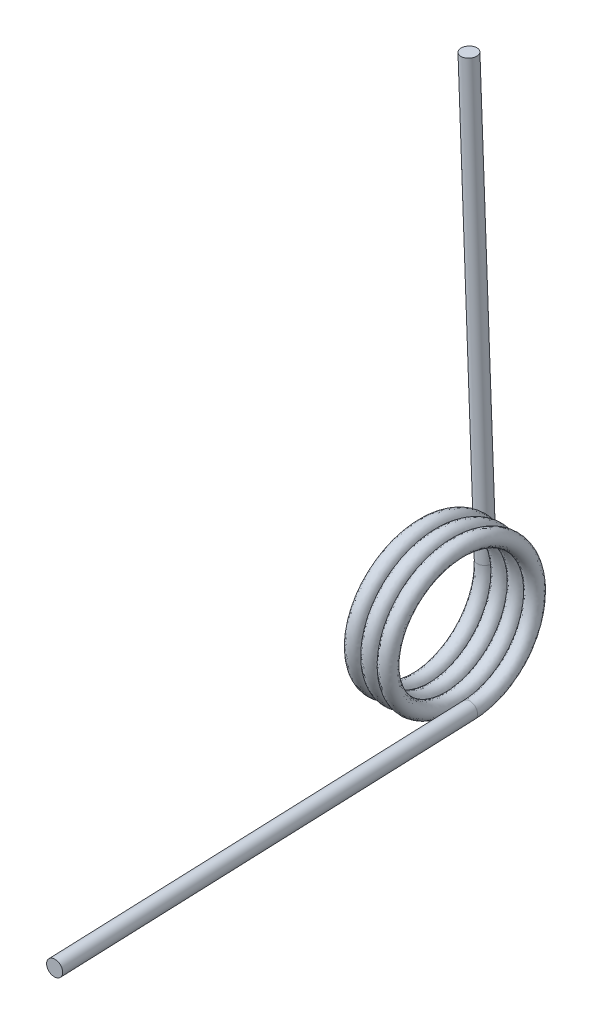
ISO-10303-21;
HEADER;
FILE_DESCRIPTION(('STEP AP214'),'2;1');
FILE_NAME('part.step','',(''),(''),'','','');
FILE_SCHEMA(('AUTOMOTIVE_DESIGN { 1 0 10303 214 1 1 1 1 }'));
ENDSEC;
DATA;
#1=APPLICATION_CONTEXT('core data for automotive mechanical design processes');
#2=APPLICATION_PROTOCOL_DEFINITION('international standard','automotive_design',2000,#1);
#3=PRODUCT_CONTEXT('',#1,'mechanical');
#4=PRODUCT('Part','Part','',(#3));
#5=PRODUCT_RELATED_PRODUCT_CATEGORY('part','',(#4));
#6=PRODUCT_DEFINITION_FORMATION('','',#4);
#7=PRODUCT_DEFINITION_CONTEXT('part definition',#1,'design');
#8=PRODUCT_DEFINITION('design','',#6,#7);
#9=PRODUCT_DEFINITION_SHAPE('','',#8);
#10=(LENGTH_UNIT() NAMED_UNIT(*) SI_UNIT(.MILLI.,.METRE.));
#11=(NAMED_UNIT(*) PLANE_ANGLE_UNIT() SI_UNIT($,.RADIAN.));
#12=(NAMED_UNIT(*) SI_UNIT($,.STERADIAN.) SOLID_ANGLE_UNIT());
#13=UNCERTAINTY_MEASURE_WITH_UNIT(LENGTH_MEASURE(1.E-05),#10,'distance_accuracy_value','');
#14=(GEOMETRIC_REPRESENTATION_CONTEXT(3) GLOBAL_UNCERTAINTY_ASSIGNED_CONTEXT((#13)) GLOBAL_UNIT_ASSIGNED_CONTEXT((#10,
#11,#12)) REPRESENTATION_CONTEXT('',''));
#15=CARTESIAN_POINT('',(0.,0.,0.));
#16=DIRECTION('',(0.,0.,1.));
#17=DIRECTION('',(1.,0.,0.));
#18=AXIS2_PLACEMENT_3D('',#15,#16,#17);
#19=CARTESIAN_POINT('',(0.228436864439154,0.00863475333797731,-2.032));
#20=CARTESIAN_POINT('',(0.26865353110582,-1.16454099365534,-2.03698527716407));
#21=CARTESIAN_POINT('',(0.308870197772487,-1.75544624382099,-1.0234779157461));
#22=CARTESIAN_POINT('',(0.349086864439153,-2.34635149398664,-0.00997055432813458));
#23=CARTESIAN_POINT('',(0.38930353110582,-1.76408099715897,1.0085220842539));
#24=CARTESIAN_POINT('',(0.429520197772487,-1.1818105003313,2.02701472283593));
#25=CARTESIAN_POINT('',(0.469736864439153,-0.00863475333797755,2.032));
#26=CARTESIAN_POINT('',(0.50995353110582,1.16454099365534,2.03698527716407));
#27=CARTESIAN_POINT('',(0.550170197772486,1.75544624382099,1.0234779157461));
#28=CARTESIAN_POINT('',(0.590386864439153,2.34635149398664,0.00997055432813486));
#29=CARTESIAN_POINT('',(0.630603531105819,1.76408099715897,-1.0085220842539));
#30=CARTESIAN_POINT('',(0.670820197772486,1.1818105003313,-2.02701472283593));
#31=CARTESIAN_POINT('',(0.711036864439153,0.00863475333797731,-2.032));
#32=CARTESIAN_POINT('',(0.751253531105819,-1.16454099365534,-2.03698527716407));
#33=CARTESIAN_POINT('',(0.791470197772486,-1.75544624382099,-1.0234779157461));
#34=CARTESIAN_POINT('',(0.831686864439152,-2.34635149398664,-0.00997055432813458));
#35=CARTESIAN_POINT('',(0.871903531105819,-1.76408099715897,1.0085220842539));
#36=CARTESIAN_POINT('',(0.912120197772486,-1.1818105003313,2.02701472283593));
#37=CARTESIAN_POINT('',(0.952336864439152,-0.00863475333797755,2.032));
#38=CARTESIAN_POINT('',(0.992553531105819,1.16454099365534,2.03698527716407));
#39=CARTESIAN_POINT('',(1.03277019777249,1.75544624382099,1.0234779157461));
#40=CARTESIAN_POINT('',(1.07298686443915,2.34635149398664,0.00997055432813486));
#41=CARTESIAN_POINT('',(1.11320353110582,1.76408099715897,-1.0085220842539));
#42=CARTESIAN_POINT('',(1.15342019777248,1.1818105003313,-2.02701472283593));
#43=CARTESIAN_POINT('',(1.19363686443915,0.00863475333797731,-2.032));
#44=CARTESIAN_POINT('',(1.23385353110582,-1.16454099365534,-2.03698527716407));
#45=CARTESIAN_POINT('',(1.27407019777248,-1.75544624382099,-1.0234779157461));
#46=CARTESIAN_POINT('',(1.31428686443915,-2.34635149398664,-0.00997055432813458));
#47=CARTESIAN_POINT('',(1.35450353110582,-1.76408099715897,1.0085220842539));
#48=CARTESIAN_POINT('',(1.39472019777248,-1.1818105003313,2.02701472283593));
#49=CARTESIAN_POINT('',(1.43493686443915,-0.00863475333797755,2.032));
#50=CARTESIAN_POINT('',(1.47515353110582,1.16454099365534,2.03698527716407));
#51=CARTESIAN_POINT('',(1.51537019777248,1.75544624382099,1.0234779157461));
#52=CARTESIAN_POINT('',(1.55558686443915,2.34635149398664,0.00997055432813486));
#53=CARTESIAN_POINT('',(1.59580353110582,1.76408099715897,-1.0085220842539));
#54=CARTESIAN_POINT('',(1.63602019777248,1.1818105003313,-2.02701472283593));
#55=CARTESIAN_POINT('',(1.67623686443915,0.00863475333797731,-2.032));
#56=CARTESIAN_POINT('',(1.71645353110582,-1.16454099365534,-2.03698527716407));
#57=CARTESIAN_POINT('',(1.75667019777248,-1.75544624382099,-1.0234779157461));
#58=CARTESIAN_POINT('',(1.79688686443915,-2.34635149398664,-0.00997055432813458));
#59=CARTESIAN_POINT('',(1.83710353110582,-1.76408099715897,1.0085220842539));
#60=CARTESIAN_POINT('',(1.87732019777248,-1.1818105003313,2.02701472283593));
#61=CARTESIAN_POINT('',(1.91753686443915,-0.00863475333797755,2.032));
#62=CARTESIAN_POINT('',(1.95775353110582,1.16454099365534,2.03698527716407));
#63=CARTESIAN_POINT('',(1.99797019777248,1.75544624382099,1.0234779157461));
#64=CARTESIAN_POINT('',(2.03818686443915,2.34635149398664,0.00997055432813486));
#65=CARTESIAN_POINT('',(2.07840353110582,1.76408099715897,-1.0085220842539));
#66=CARTESIAN_POINT('',(2.11862019777248,1.1818105003313,-2.02701472283593));
#67=CARTESIAN_POINT('',(2.15883686443915,0.00863475333797731,-2.032));
#68=CARTESIAN_POINT('',(0.228436864439154,0.00863475333797731,-1.5748));
#69=CARTESIAN_POINT('',(0.26865353110582,-0.900576450581845,-1.57978527716407));
#70=CARTESIAN_POINT('',(0.308870197772487,-1.35949942921074,-0.794877915746101));
#71=CARTESIAN_POINT('',(0.349086864439153,-1.81842240783965,-0.00997055432813455));
#72=CARTESIAN_POINT('',(0.38930353110582,-1.36813418254872,0.779922084253899));
#73=CARTESIAN_POINT('',(0.429520197772487,-0.9178459572578,1.56981472283593));
#74=CARTESIAN_POINT('',(0.469736864439153,-0.0086347533379775,1.5748));
#75=CARTESIAN_POINT('',(0.50995353110582,0.900576450581845,1.57978527716407));
#76=CARTESIAN_POINT('',(0.550170197772486,1.35949942921074,0.794877915746101));
#77=CARTESIAN_POINT('',(0.590386864439153,1.81842240783965,0.00997055432813477));
#78=CARTESIAN_POINT('',(0.630603531105819,1.36813418254872,-0.779922084253898));
#79=CARTESIAN_POINT('',(0.670820197772486,0.917845957257801,-1.56981472283593));
#80=CARTESIAN_POINT('',(0.711036864439153,0.00863475333797731,-1.5748));
#81=CARTESIAN_POINT('',(0.751253531105819,-0.900576450581845,-1.57978527716407));
#82=CARTESIAN_POINT('',(0.791470197772486,-1.35949942921074,-0.794877915746101));
#83=CARTESIAN_POINT('',(0.831686864439153,-1.81842240783965,-0.00997055432813455));
#84=CARTESIAN_POINT('',(0.871903531105819,-1.36813418254872,0.779922084253899));
#85=CARTESIAN_POINT('',(0.912120197772486,-0.9178459572578,1.56981472283593));
#86=CARTESIAN_POINT('',(0.952336864439152,-0.0086347533379775,1.5748));
#87=CARTESIAN_POINT('',(0.992553531105819,0.900576450581845,1.57978527716407));
#88=CARTESIAN_POINT('',(1.03277019777249,1.35949942921074,0.794877915746101));
#89=CARTESIAN_POINT('',(1.07298686443915,1.81842240783965,0.00997055432813477));
#90=CARTESIAN_POINT('',(1.11320353110582,1.36813418254872,-0.779922084253898));
#91=CARTESIAN_POINT('',(1.15342019777248,0.917845957257801,-1.56981472283593));
#92=CARTESIAN_POINT('',(1.19363686443915,0.00863475333797731,-1.5748));
#93=CARTESIAN_POINT('',(1.23385353110582,-0.900576450581845,-1.57978527716407));
#94=CARTESIAN_POINT('',(1.27407019777248,-1.35949942921074,-0.794877915746101));
#95=CARTESIAN_POINT('',(1.31428686443915,-1.81842240783965,-0.00997055432813455));
#96=CARTESIAN_POINT('',(1.35450353110582,-1.36813418254872,0.779922084253899));
#97=CARTESIAN_POINT('',(1.39472019777248,-0.9178459572578,1.56981472283593));
#98=CARTESIAN_POINT('',(1.43493686443915,-0.0086347533379775,1.5748));
#99=CARTESIAN_POINT('',(1.47515353110582,0.900576450581845,1.57978527716407));
#100=CARTESIAN_POINT('',(1.51537019777248,1.35949942921074,0.794877915746101));
#101=CARTESIAN_POINT('',(1.55558686443915,1.81842240783965,0.00997055432813477));
#102=CARTESIAN_POINT('',(1.59580353110582,1.36813418254872,-0.779922084253898));
#103=CARTESIAN_POINT('',(1.63602019777248,0.917845957257801,-1.56981472283593));
#104=CARTESIAN_POINT('',(1.67623686443915,0.00863475333797731,-1.5748));
#105=CARTESIAN_POINT('',(1.71645353110582,-0.900576450581845,-1.57978527716407));
#106=CARTESIAN_POINT('',(1.75667019777248,-1.35949942921074,-0.794877915746101));
#107=CARTESIAN_POINT('',(1.79688686443915,-1.81842240783965,-0.00997055432813455));
#108=CARTESIAN_POINT('',(1.83710353110582,-1.36813418254872,0.779922084253899));
#109=CARTESIAN_POINT('',(1.87732019777248,-0.9178459572578,1.56981472283593));
#110=CARTESIAN_POINT('',(1.91753686443915,-0.0086347533379775,1.5748));
#111=CARTESIAN_POINT('',(1.95775353110582,0.900576450581845,1.57978527716407));
#112=CARTESIAN_POINT('',(1.99797019777248,1.35949942921074,0.794877915746101));
#113=CARTESIAN_POINT('',(2.03818686443915,1.81842240783965,0.00997055432813477));
#114=CARTESIAN_POINT('',(2.07840353110582,1.36813418254872,-0.779922084253898));
#115=CARTESIAN_POINT('',(2.11862019777248,0.917845957257801,-1.56981472283593));
#116=CARTESIAN_POINT('',(2.15883686443915,0.00863475333797731,-1.5748));
#117=CARTESIAN_POINT('',(-0.228436864439154,-0.0086347533379773,-1.5748));
#118=CARTESIAN_POINT('',(-0.188220197772487,-0.9178459572578,-1.56981472283593));
#119=CARTESIAN_POINT('',(-0.148003531105821,-1.36813418254872,-0.779922084253899));
#120=CARTESIAN_POINT('',(-0.107786864439154,-1.81842240783965,0.00997055432813432));
#121=CARTESIAN_POINT('',(-0.0675701977724874,-1.35949942921075,0.7948779157461));
#122=CARTESIAN_POINT('',(-0.0273535311058208,-0.900576450581846,1.57978527716407));
#123=CARTESIAN_POINT('',(0.0128631355608458,0.00863475333797711,1.5748));
#124=CARTESIAN_POINT('',(0.0530798022275124,0.917845957257799,1.56981472283593));
#125=CARTESIAN_POINT('',(0.0932964688941789,1.36813418254872,0.7799220842539));
#126=CARTESIAN_POINT('',(0.133513135560846,1.81842240783965,-0.0099705543281341));
#127=CARTESIAN_POINT('',(0.173729802227512,1.35949942921075,-0.7948779157461));
#128=CARTESIAN_POINT('',(0.213946468894179,0.900576450581846,-1.57978527716407));
#129=CARTESIAN_POINT('',(0.254163135560845,-0.0086347533379773,-1.5748));
#130=CARTESIAN_POINT('',(0.294379802227512,-0.9178459572578,-1.56981472283593));
#131=CARTESIAN_POINT('',(0.334596468894178,-1.36813418254872,-0.779922084253899));
#132=CARTESIAN_POINT('',(0.374813135560845,-1.81842240783965,0.00997055432813432));
#133=CARTESIAN_POINT('',(0.415029802227512,-1.35949942921075,0.7948779157461));
#134=CARTESIAN_POINT('',(0.455246468894178,-0.900576450581846,1.57978527716407));
#135=CARTESIAN_POINT('',(0.495463135560845,0.00863475333797711,1.5748));
#136=CARTESIAN_POINT('',(0.535679802227511,0.917845957257799,1.56981472283593));
#137=CARTESIAN_POINT('',(0.575896468894178,1.36813418254872,0.7799220842539));
#138=CARTESIAN_POINT('',(0.616113135560844,1.81842240783965,-0.0099705543281341));
#139=CARTESIAN_POINT('',(0.656329802227511,1.35949942921075,-0.7948779157461));
#140=CARTESIAN_POINT('',(0.696546468894178,0.900576450581846,-1.57978527716407));
#141=CARTESIAN_POINT('',(0.736763135560844,-0.0086347533379773,-1.5748));
#142=CARTESIAN_POINT('',(0.776979802227511,-0.9178459572578,-1.56981472283593));
#143=CARTESIAN_POINT('',(0.817196468894177,-1.36813418254872,-0.779922084253899));
#144=CARTESIAN_POINT('',(0.857413135560844,-1.81842240783965,0.00997055432813432));
#145=CARTESIAN_POINT('',(0.897629802227511,-1.35949942921075,0.7948779157461));
#146=CARTESIAN_POINT('',(0.937846468894177,-0.900576450581846,1.57978527716407));
#147=CARTESIAN_POINT('',(0.978063135560844,0.00863475333797711,1.5748));
#148=CARTESIAN_POINT('',(1.01827980222751,0.917845957257799,1.56981472283593));
#149=CARTESIAN_POINT('',(1.05849646889418,1.36813418254872,0.7799220842539));
#150=CARTESIAN_POINT('',(1.09871313556084,1.81842240783965,-0.0099705543281341));
#151=CARTESIAN_POINT('',(1.13892980222751,1.35949942921075,-0.7948779157461));
#152=CARTESIAN_POINT('',(1.17914646889418,0.900576450581846,-1.57978527716407));
#153=CARTESIAN_POINT('',(1.21936313556084,-0.0086347533379773,-1.5748));
#154=CARTESIAN_POINT('',(1.25957980222751,-0.9178459572578,-1.56981472283593));
#155=CARTESIAN_POINT('',(1.29979646889418,-1.36813418254872,-0.779922084253899));
#156=CARTESIAN_POINT('',(1.34001313556084,-1.81842240783965,0.00997055432813432));
#157=CARTESIAN_POINT('',(1.38022980222751,-1.35949942921075,0.7948779157461));
#158=CARTESIAN_POINT('',(1.42044646889418,-0.900576450581846,1.57978527716407));
#159=CARTESIAN_POINT('',(1.46066313556084,0.00863475333797711,1.5748));
#160=CARTESIAN_POINT('',(1.50087980222751,0.917845957257799,1.56981472283593));
#161=CARTESIAN_POINT('',(1.54109646889418,1.36813418254872,0.7799220842539));
#162=CARTESIAN_POINT('',(1.58131313556084,1.81842240783965,-0.0099705543281341));
#163=CARTESIAN_POINT('',(1.62152980222751,1.35949942921075,-0.7948779157461));
#164=CARTESIAN_POINT('',(1.66174646889418,0.900576450581846,-1.57978527716407));
#165=CARTESIAN_POINT('',(1.70196313556084,-0.0086347533379773,-1.5748));
#166=CARTESIAN_POINT('',(-0.228436864439154,-0.00863475333797731,-2.032));
#167=CARTESIAN_POINT('',(-0.188220197772487,-1.1818105003313,-2.02701472283593));
#168=CARTESIAN_POINT('',(-0.148003531105821,-1.76408099715897,-1.0085220842539));
#169=CARTESIAN_POINT('',(-0.107786864439154,-2.34635149398664,0.00997055432813429));
#170=CARTESIAN_POINT('',(-0.0675701977724874,-1.75544624382099,1.0234779157461));
#171=CARTESIAN_POINT('',(-0.0273535311058209,-1.16454099365534,2.03698527716407));
#172=CARTESIAN_POINT('',(0.0128631355608457,0.00863475333797706,2.032));
#173=CARTESIAN_POINT('',(0.0530798022275123,1.1818105003313,2.02701472283593));
#174=CARTESIAN_POINT('',(0.0932964688941789,1.76408099715897,1.0085220842539));
#175=CARTESIAN_POINT('',(0.133513135560845,2.34635149398664,-0.009970554328134));
#176=CARTESIAN_POINT('',(0.173729802227512,1.75544624382099,-1.0234779157461));
#177=CARTESIAN_POINT('',(0.213946468894179,1.16454099365534,-2.03698527716407));
#178=CARTESIAN_POINT('',(0.254163135560845,-0.00863475333797731,-2.032));
#179=CARTESIAN_POINT('',(0.294379802227512,-1.1818105003313,-2.02701472283593));
#180=CARTESIAN_POINT('',(0.334596468894178,-1.76408099715897,-1.0085220842539));
#181=CARTESIAN_POINT('',(0.374813135560845,-2.34635149398664,0.00997055432813429));
#182=CARTESIAN_POINT('',(0.415029802227511,-1.75544624382099,1.0234779157461));
#183=CARTESIAN_POINT('',(0.455246468894178,-1.16454099365534,2.03698527716407));
#184=CARTESIAN_POINT('',(0.495463135560845,0.00863475333797706,2.032));
#185=CARTESIAN_POINT('',(0.535679802227511,1.1818105003313,2.02701472283593));
#186=CARTESIAN_POINT('',(0.575896468894178,1.76408099715897,1.0085220842539));
#187=CARTESIAN_POINT('',(0.616113135560844,2.34635149398664,-0.009970554328134));
#188=CARTESIAN_POINT('',(0.656329802227511,1.75544624382099,-1.0234779157461));
#189=CARTESIAN_POINT('',(0.696546468894177,1.16454099365534,-2.03698527716407));
#190=CARTESIAN_POINT('',(0.736763135560844,-0.00863475333797731,-2.032));
#191=CARTESIAN_POINT('',(0.776979802227511,-1.1818105003313,-2.02701472283593));
#192=CARTESIAN_POINT('',(0.817196468894177,-1.76408099715897,-1.0085220842539));
#193=CARTESIAN_POINT('',(0.857413135560844,-2.34635149398664,0.00997055432813429));
#194=CARTESIAN_POINT('',(0.89762980222751,-1.75544624382099,1.0234779157461));
#195=CARTESIAN_POINT('',(0.937846468894177,-1.16454099365534,2.03698527716407));
#196=CARTESIAN_POINT('',(0.978063135560844,0.00863475333797706,2.032));
#197=CARTESIAN_POINT('',(1.01827980222751,1.1818105003313,2.02701472283593));
#198=CARTESIAN_POINT('',(1.05849646889418,1.76408099715897,1.0085220842539));
#199=CARTESIAN_POINT('',(1.09871313556084,2.34635149398664,-0.009970554328134));
#200=CARTESIAN_POINT('',(1.13892980222751,1.75544624382099,-1.0234779157461));
#201=CARTESIAN_POINT('',(1.17914646889418,1.16454099365534,-2.03698527716407));
#202=CARTESIAN_POINT('',(1.21936313556084,-0.00863475333797731,-2.032));
#203=CARTESIAN_POINT('',(1.25957980222751,-1.1818105003313,-2.02701472283593));
#204=CARTESIAN_POINT('',(1.29979646889418,-1.76408099715897,-1.0085220842539));
#205=CARTESIAN_POINT('',(1.34001313556084,-2.34635149398664,0.00997055432813429));
#206=CARTESIAN_POINT('',(1.38022980222751,-1.75544624382099,1.0234779157461));
#207=CARTESIAN_POINT('',(1.42044646889418,-1.16454099365534,2.03698527716407));
#208=CARTESIAN_POINT('',(1.46066313556084,0.00863475333797706,2.032));
#209=CARTESIAN_POINT('',(1.50087980222751,1.1818105003313,2.02701472283593));
#210=CARTESIAN_POINT('',(1.54109646889418,1.76408099715897,1.0085220842539));
#211=CARTESIAN_POINT('',(1.58131313556084,2.34635149398664,-0.009970554328134));
#212=CARTESIAN_POINT('',(1.62152980222751,1.75544624382099,-1.0234779157461));
#213=CARTESIAN_POINT('',(1.66174646889418,1.16454099365534,-2.03698527716407));
#214=CARTESIAN_POINT('',(1.70196313556084,-0.00863475333797731,-2.032));
#215=CARTESIAN_POINT('',(-0.228436864439154,-0.00863475333797731,-2.4892));
#216=CARTESIAN_POINT('',(-0.188220197772487,-1.44577504340479,-2.48421472283593));
#217=CARTESIAN_POINT('',(-0.148003531105821,-2.16002781176921,-1.2371220842539));
#218=CARTESIAN_POINT('',(-0.107786864439154,-2.87428058013363,0.00997055432813426));
#219=CARTESIAN_POINT('',(-0.0675701977724875,-2.15139305843124,1.2520779157461));
#220=CARTESIAN_POINT('',(-0.027353531105821,-1.42850553672884,2.49418527716407));
#221=CARTESIAN_POINT('',(0.0128631355608456,0.008634753337977,2.4892));
#222=CARTESIAN_POINT('',(0.0530798022275122,1.44577504340479,2.48421472283593));
#223=CARTESIAN_POINT('',(0.0932964688941788,2.16002781176921,1.2371220842539));
#224=CARTESIAN_POINT('',(0.133513135560845,2.87428058013363,-0.00997055432813391));
#225=CARTESIAN_POINT('',(0.173729802227512,2.15139305843124,-1.2520779157461));
#226=CARTESIAN_POINT('',(0.213946468894178,1.42850553672884,-2.49418527716407));
#227=CARTESIAN_POINT('',(0.254163135560845,-0.00863475333797731,-2.4892));
#228=CARTESIAN_POINT('',(0.294379802227512,-1.44577504340479,-2.48421472283593));
#229=CARTESIAN_POINT('',(0.334596468894178,-2.16002781176921,-1.2371220842539));
#230=CARTESIAN_POINT('',(0.374813135560845,-2.87428058013363,0.00997055432813426));
#231=CARTESIAN_POINT('',(0.415029802227511,-2.15139305843124,1.2520779157461));
#232=CARTESIAN_POINT('',(0.455246468894178,-1.42850553672884,2.49418527716407));
#233=CARTESIAN_POINT('',(0.495463135560844,0.008634753337977,2.4892));
#234=CARTESIAN_POINT('',(0.535679802227511,1.44577504340479,2.48421472283593));
#235=CARTESIAN_POINT('',(0.575896468894178,2.16002781176921,1.2371220842539));
#236=CARTESIAN_POINT('',(0.616113135560844,2.87428058013363,-0.00997055432813391));
#237=CARTESIAN_POINT('',(0.656329802227511,2.15139305843124,-1.2520779157461));
#238=CARTESIAN_POINT('',(0.696546468894177,1.42850553672884,-2.49418527716407));
#239=CARTESIAN_POINT('',(0.736763135560844,-0.00863475333797731,-2.4892));
#240=CARTESIAN_POINT('',(0.776979802227511,-1.44577504340479,-2.48421472283593));
#241=CARTESIAN_POINT('',(0.817196468894177,-2.16002781176921,-1.2371220842539));
#242=CARTESIAN_POINT('',(0.857413135560844,-2.87428058013363,0.00997055432813426));
#243=CARTESIAN_POINT('',(0.897629802227511,-2.15139305843124,1.2520779157461));
#244=CARTESIAN_POINT('',(0.937846468894177,-1.42850553672884,2.49418527716407));
#245=CARTESIAN_POINT('',(0.978063135560844,0.008634753337977,2.4892));
#246=CARTESIAN_POINT('',(1.01827980222751,1.44577504340479,2.48421472283593));
#247=CARTESIAN_POINT('',(1.05849646889418,2.16002781176921,1.2371220842539));
#248=CARTESIAN_POINT('',(1.09871313556084,2.87428058013363,-0.00997055432813391));
#249=CARTESIAN_POINT('',(1.13892980222751,2.15139305843124,-1.2520779157461));
#250=CARTESIAN_POINT('',(1.17914646889418,1.42850553672884,-2.49418527716407));
#251=CARTESIAN_POINT('',(1.21936313556084,-0.00863475333797731,-2.4892));
#252=CARTESIAN_POINT('',(1.25957980222751,-1.44577504340479,-2.48421472283593));
#253=CARTESIAN_POINT('',(1.29979646889418,-2.16002781176921,-1.2371220842539));
#254=CARTESIAN_POINT('',(1.34001313556084,-2.87428058013363,0.00997055432813426));
#255=CARTESIAN_POINT('',(1.38022980222751,-2.15139305843124,1.2520779157461));
#256=CARTESIAN_POINT('',(1.42044646889418,-1.42850553672884,2.49418527716407));
#257=CARTESIAN_POINT('',(1.46066313556084,0.008634753337977,2.4892));
#258=CARTESIAN_POINT('',(1.50087980222751,1.44577504340479,2.48421472283593));
#259=CARTESIAN_POINT('',(1.54109646889418,2.16002781176921,1.2371220842539));
#260=CARTESIAN_POINT('',(1.58131313556084,2.87428058013363,-0.00997055432813391));
#261=CARTESIAN_POINT('',(1.62152980222751,2.15139305843124,-1.2520779157461));
#262=CARTESIAN_POINT('',(1.66174646889418,1.42850553672884,-2.49418527716407));
#263=CARTESIAN_POINT('',(1.70196313556084,-0.00863475333797731,-2.4892));
#264=CARTESIAN_POINT('',(0.228436864439154,0.00863475333797731,-2.4892));
#265=CARTESIAN_POINT('',(0.26865353110582,-1.42850553672884,-2.49418527716407));
#266=CARTESIAN_POINT('',(0.308870197772487,-2.15139305843124,-1.2520779157461));
#267=CARTESIAN_POINT('',(0.349086864439153,-2.87428058013363,-0.00997055432813461));
#268=CARTESIAN_POINT('',(0.38930353110582,-2.16002781176921,1.2371220842539));
#269=CARTESIAN_POINT('',(0.429520197772487,-1.44577504340479,2.48421472283593));
#270=CARTESIAN_POINT('',(0.469736864439153,-0.00863475333797761,2.4892));
#271=CARTESIAN_POINT('',(0.50995353110582,1.42850553672884,2.49418527716407));
#272=CARTESIAN_POINT('',(0.550170197772486,2.15139305843124,1.2520779157461));
#273=CARTESIAN_POINT('',(0.590386864439153,2.87428058013363,0.00997055432813496));
#274=CARTESIAN_POINT('',(0.630603531105819,2.16002781176921,-1.2371220842539));
#275=CARTESIAN_POINT('',(0.670820197772486,1.44577504340479,-2.48421472283593));
#276=CARTESIAN_POINT('',(0.711036864439153,0.00863475333797731,-2.4892));
#277=CARTESIAN_POINT('',(0.751253531105819,-1.42850553672884,-2.49418527716407));
#278=CARTESIAN_POINT('',(0.791470197772486,-2.15139305843124,-1.2520779157461));
#279=CARTESIAN_POINT('',(0.831686864439153,-2.87428058013363,-0.00997055432813461));
#280=CARTESIAN_POINT('',(0.871903531105819,-2.16002781176921,1.2371220842539));
#281=CARTESIAN_POINT('',(0.912120197772486,-1.44577504340479,2.48421472283593));
#282=CARTESIAN_POINT('',(0.952336864439152,-0.00863475333797761,2.4892));
#283=CARTESIAN_POINT('',(0.992553531105819,1.42850553672884,2.49418527716407));
#284=CARTESIAN_POINT('',(1.03277019777249,2.15139305843124,1.2520779157461));
#285=CARTESIAN_POINT('',(1.07298686443915,2.87428058013363,0.00997055432813496));
#286=CARTESIAN_POINT('',(1.11320353110582,2.16002781176921,-1.2371220842539));
#287=CARTESIAN_POINT('',(1.15342019777248,1.44577504340479,-2.48421472283593));
#288=CARTESIAN_POINT('',(1.19363686443915,0.00863475333797731,-2.4892));
#289=CARTESIAN_POINT('',(1.23385353110582,-1.42850553672884,-2.49418527716407));
#290=CARTESIAN_POINT('',(1.27407019777248,-2.15139305843124,-1.2520779157461));
#291=CARTESIAN_POINT('',(1.31428686443915,-2.87428058013363,-0.00997055432813461));
#292=CARTESIAN_POINT('',(1.35450353110582,-2.16002781176921,1.2371220842539));
#293=CARTESIAN_POINT('',(1.39472019777248,-1.44577504340479,2.48421472283593));
#294=CARTESIAN_POINT('',(1.43493686443915,-0.00863475333797761,2.4892));
#295=CARTESIAN_POINT('',(1.47515353110582,1.42850553672884,2.49418527716407));
#296=CARTESIAN_POINT('',(1.51537019777248,2.15139305843124,1.2520779157461));
#297=CARTESIAN_POINT('',(1.55558686443915,2.87428058013363,0.00997055432813496));
#298=CARTESIAN_POINT('',(1.59580353110582,2.16002781176921,-1.2371220842539));
#299=CARTESIAN_POINT('',(1.63602019777248,1.44577504340479,-2.48421472283593));
#300=CARTESIAN_POINT('',(1.67623686443915,0.00863475333797731,-2.4892));
#301=CARTESIAN_POINT('',(1.71645353110582,-1.42850553672884,-2.49418527716407));
#302=CARTESIAN_POINT('',(1.75667019777248,-2.15139305843124,-1.2520779157461));
#303=CARTESIAN_POINT('',(1.79688686443915,-2.87428058013363,-0.00997055432813461));
#304=CARTESIAN_POINT('',(1.83710353110582,-2.16002781176921,1.2371220842539));
#305=CARTESIAN_POINT('',(1.87732019777248,-1.44577504340479,2.48421472283593));
#306=CARTESIAN_POINT('',(1.91753686443915,-0.00863475333797761,2.4892));
#307=CARTESIAN_POINT('',(1.95775353110582,1.42850553672884,2.49418527716407));
#308=CARTESIAN_POINT('',(1.99797019777248,2.15139305843124,1.2520779157461));
#309=CARTESIAN_POINT('',(2.03818686443915,2.87428058013363,0.00997055432813496));
#310=CARTESIAN_POINT('',(2.07840353110582,2.16002781176921,-1.2371220842539));
#311=CARTESIAN_POINT('',(2.11862019777248,1.44577504340479,-2.48421472283593));
#312=CARTESIAN_POINT('',(2.15883686443915,0.00863475333797731,-2.4892));
#313=CARTESIAN_POINT('',(0.228436864439154,0.00863475333797731,-2.032));
#314=CARTESIAN_POINT('',(0.26865353110582,-1.16454099365534,-2.03698527716407));
#315=CARTESIAN_POINT('',(0.308870197772487,-1.75544624382099,-1.0234779157461));
#316=CARTESIAN_POINT('',(0.349086864439153,-2.34635149398664,-0.00997055432813458));
#317=CARTESIAN_POINT('',(0.38930353110582,-1.76408099715897,1.0085220842539));
#318=CARTESIAN_POINT('',(0.429520197772487,-1.1818105003313,2.02701472283593));
#319=CARTESIAN_POINT('',(0.469736864439153,-0.00863475333797755,2.032));
#320=CARTESIAN_POINT('',(0.50995353110582,1.16454099365534,2.03698527716407));
#321=CARTESIAN_POINT('',(0.550170197772486,1.75544624382099,1.0234779157461));
#322=CARTESIAN_POINT('',(0.590386864439153,2.34635149398664,0.00997055432813486));
#323=CARTESIAN_POINT('',(0.630603531105819,1.76408099715897,-1.0085220842539));
#324=CARTESIAN_POINT('',(0.670820197772486,1.1818105003313,-2.02701472283593));
#325=CARTESIAN_POINT('',(0.711036864439153,0.00863475333797731,-2.032));
#326=CARTESIAN_POINT('',(0.751253531105819,-1.16454099365534,-2.03698527716407));
#327=CARTESIAN_POINT('',(0.791470197772486,-1.75544624382099,-1.0234779157461));
#328=CARTESIAN_POINT('',(0.831686864439152,-2.34635149398664,-0.00997055432813458));
#329=CARTESIAN_POINT('',(0.871903531105819,-1.76408099715897,1.0085220842539));
#330=CARTESIAN_POINT('',(0.912120197772486,-1.1818105003313,2.02701472283593));
#331=CARTESIAN_POINT('',(0.952336864439152,-0.00863475333797755,2.032));
#332=CARTESIAN_POINT('',(0.992553531105819,1.16454099365534,2.03698527716407));
#333=CARTESIAN_POINT('',(1.03277019777249,1.75544624382099,1.0234779157461));
#334=CARTESIAN_POINT('',(1.07298686443915,2.34635149398664,0.00997055432813486));
#335=CARTESIAN_POINT('',(1.11320353110582,1.76408099715897,-1.0085220842539));
#336=CARTESIAN_POINT('',(1.15342019777248,1.1818105003313,-2.02701472283593));
#337=CARTESIAN_POINT('',(1.19363686443915,0.00863475333797731,-2.032));
#338=CARTESIAN_POINT('',(1.23385353110582,-1.16454099365534,-2.03698527716407));
#339=CARTESIAN_POINT('',(1.27407019777248,-1.75544624382099,-1.0234779157461));
#340=CARTESIAN_POINT('',(1.31428686443915,-2.34635149398664,-0.00997055432813458));
#341=CARTESIAN_POINT('',(1.35450353110582,-1.76408099715897,1.0085220842539));
#342=CARTESIAN_POINT('',(1.39472019777248,-1.1818105003313,2.02701472283593));
#343=CARTESIAN_POINT('',(1.43493686443915,-0.00863475333797755,2.032));
#344=CARTESIAN_POINT('',(1.47515353110582,1.16454099365534,2.03698527716407));
#345=CARTESIAN_POINT('',(1.51537019777248,1.75544624382099,1.0234779157461));
#346=CARTESIAN_POINT('',(1.55558686443915,2.34635149398664,0.00997055432813486));
#347=CARTESIAN_POINT('',(1.59580353110582,1.76408099715897,-1.0085220842539));
#348=CARTESIAN_POINT('',(1.63602019777248,1.1818105003313,-2.02701472283593));
#349=CARTESIAN_POINT('',(1.67623686443915,0.00863475333797731,-2.032));
#350=CARTESIAN_POINT('',(1.71645353110582,-1.16454099365534,-2.03698527716407));
#351=CARTESIAN_POINT('',(1.75667019777248,-1.75544624382099,-1.0234779157461));
#352=CARTESIAN_POINT('',(1.79688686443915,-2.34635149398664,-0.00997055432813458));
#353=CARTESIAN_POINT('',(1.83710353110582,-1.76408099715897,1.0085220842539));
#354=CARTESIAN_POINT('',(1.87732019777248,-1.1818105003313,2.02701472283593));
#355=CARTESIAN_POINT('',(1.91753686443915,-0.00863475333797755,2.032));
#356=CARTESIAN_POINT('',(1.95775353110582,1.16454099365534,2.03698527716407));
#357=CARTESIAN_POINT('',(1.99797019777248,1.75544624382099,1.0234779157461));
#358=CARTESIAN_POINT('',(2.03818686443915,2.34635149398664,0.00997055432813486));
#359=CARTESIAN_POINT('',(2.07840353110582,1.76408099715897,-1.0085220842539));
#360=CARTESIAN_POINT('',(2.11862019777248,1.1818105003313,-2.02701472283593));
#361=CARTESIAN_POINT('',(2.15883686443915,0.00863475333797731,-2.032));
#362=(BOUNDED_SURFACE() B_SPLINE_SURFACE(3,2,((#19,#20,#21,#22,#23,#24,#25,#26,#27,#28,#29,#30,
#31,#32,#33,#34,#35,#36,#37,#38,#39,#40,#41,#42,#43,#44,#45,#46,#47,#48,#49,#50,#51,#52,#53,#54,
#55,#56,#57,#58,#59,#60,#61,#62,#63,#64,#65,#66,#67),(#68,#69,#70,#71,#72,#73,#74,#75,#76,#77,
#78,#79,#80,#81,#82,#83,#84,#85,#86,#87,#88,#89,#90,#91,#92,#93,#94,#95,#96,#97,#98,#99,#100,
#101,#102,#103,#104,#105,#106,#107,#108,#109,#110,#111,#112,#113,#114,#115,#116),(#117,#118,
#119,#120,#121,#122,#123,#124,#125,#126,#127,#128,#129,#130,#131,#132,#133,#134,#135,#136,#137,
#138,#139,#140,#141,#142,#143,#144,#145,#146,#147,#148,#149,#150,#151,#152,#153,#154,#155,#156,
#157,#158,#159,#160,#161,#162,#163,#164,#165),(#166,#167,#168,#169,#170,#171,#172,#173,#174,
#175,#176,#177,#178,#179,#180,#181,#182,#183,#184,#185,#186,#187,#188,#189,#190,#191,#192,#193,
#194,#195,#196,#197,#198,#199,#200,#201,#202,#203,#204,#205,#206,#207,#208,#209,#210,#211,#212,
#213,#214),(#215,#216,#217,#218,#219,#220,#221,#222,#223,#224,#225,#226,#227,#228,#229,#230,
#231,#232,#233,#234,#235,#236,#237,#238,#239,#240,#241,#242,#243,#244,#245,#246,#247,#248,#249,
#250,#251,#252,#253,#254,#255,#256,#257,#258,#259,#260,#261,#262,#263),(#264,#265,#266,#267,
#268,#269,#270,#271,#272,#273,#274,#275,#276,#277,#278,#279,#280,#281,#282,#283,#284,#285,#286,
#287,#288,#289,#290,#291,#292,#293,#294,#295,#296,#297,#298,#299,#300,#301,#302,#303,#304,#305,
#306,#307,#308,#309,#310,#311,#312),(#313,#314,#315,#316,#317,#318,#319,#320,#321,#322,#323,
#324,#325,#326,#327,#328,#329,#330,#331,#332,#333,#334,#335,#336,#337,#338,#339,#340,#341,#342,
#343,#344,#345,#346,#347,#348,#349,#350,#351,#352,#353,#354,#355,#356,#357,#358,#359,#360,
#361)),.UNSPECIFIED.,.T.,.F.,.F.) B_SPLINE_SURFACE_WITH_KNOTS((4,3,4),(3,2,2,2,2,2,2,2,2,2,2,2,
2,2,2,2,2,2,2,2,2,2,2,2,3),(0.,0.5,1.),(0.,0.0416666666666667,0.0833333333333333,0.125,
0.166666666666667,0.208333333333333,0.25,0.291666666666667,0.333333333333333,0.375,
0.416666666666667,0.458333333333333,0.5,0.541666666666667,0.583333333333333,0.625,
0.666666666666667,0.708333333333333,0.75,0.791666666666667,0.833333333333333,0.875,
0.916666666666667,0.958333333333333,1.),
.UNSPECIFIED.) GEOMETRIC_REPRESENTATION_ITEM() RATIONAL_B_SPLINE_SURFACE(((1.,0.866025403784439,
1.,0.866025403784439,1.,0.866025403784439,1.,0.866025403784439,1.,0.866025403784439,1.,
0.866025403784439,1.,0.866025403784439,1.,0.866025403784439,1.,0.866025403784439,1.,
0.866025403784439,1.,0.866025403784439,1.,0.866025403784439,1.,0.866025403784439,1.,
0.866025403784439,1.,0.866025403784439,1.,0.866025403784439,1.,0.866025403784439,1.,
0.866025403784439,1.,0.866025403784439,1.,0.866025403784439,1.,0.866025403784439,1.,
0.866025403784439,1.,0.866025403784439,1.,0.866025403784439,1.),(0.333333333333333,
0.288675134594813,0.333333333333333,0.288675134594813,0.333333333333333,0.288675134594813,
0.333333333333333,0.288675134594813,0.333333333333333,0.288675134594813,0.333333333333333,
0.288675134594813,0.333333333333333,0.288675134594813,0.333333333333333,0.288675134594813,
0.333333333333333,0.288675134594813,0.333333333333333,0.288675134594813,0.333333333333333,
0.288675134594813,0.333333333333333,0.288675134594813,0.333333333333333,0.288675134594813,
0.333333333333333,0.288675134594813,0.333333333333333,0.288675134594813,0.333333333333333,
0.288675134594813,0.333333333333333,0.288675134594813,0.333333333333333,0.288675134594813,
0.333333333333333,0.288675134594813,0.333333333333333,0.288675134594813,0.333333333333333,
0.288675134594813,0.333333333333333,0.288675134594813,0.333333333333333,0.288675134594813,
0.333333333333333,0.288675134594813,0.333333333333333),(0.333333333333333,0.288675134594813,
0.333333333333333,0.288675134594813,0.333333333333333,0.288675134594813,0.333333333333333,
0.288675134594813,0.333333333333333,0.288675134594813,0.333333333333333,0.288675134594813,
0.333333333333333,0.288675134594813,0.333333333333333,0.288675134594813,0.333333333333333,
0.288675134594813,0.333333333333333,0.288675134594813,0.333333333333333,0.288675134594813,
0.333333333333333,0.288675134594813,0.333333333333333,0.288675134594813,0.333333333333333,
0.288675134594813,0.333333333333333,0.288675134594813,0.333333333333333,0.288675134594813,
0.333333333333333,0.288675134594813,0.333333333333333,0.288675134594813,0.333333333333333,
0.288675134594813,0.333333333333333,0.288675134594813,0.333333333333333,0.288675134594813,
0.333333333333333,0.288675134594813,0.333333333333333,0.288675134594813,0.333333333333333,
0.288675134594813,0.333333333333333),(1.,0.866025403784439,1.,0.866025403784439,1.,
0.866025403784439,1.,0.866025403784439,1.,0.866025403784439,1.,0.866025403784439,1.,
0.866025403784439,1.,0.866025403784439,1.,0.866025403784439,1.,0.866025403784439,1.,
0.866025403784439,1.,0.866025403784439,1.,0.866025403784439,1.,0.866025403784439,1.,
0.866025403784439,1.,0.866025403784439,1.,0.866025403784439,1.,0.866025403784439,1.,
0.866025403784439,1.,0.866025403784439,1.,0.866025403784439,1.,0.866025403784439,1.,
0.866025403784439,1.,0.866025403784439,1.),(0.333333333333333,0.288675134594813,
0.333333333333333,0.288675134594813,0.333333333333333,0.288675134594813,0.333333333333333,
0.288675134594813,0.333333333333333,0.288675134594813,0.333333333333333,0.288675134594813,
0.333333333333333,0.288675134594813,0.333333333333333,0.288675134594813,0.333333333333333,
0.288675134594813,0.333333333333333,0.288675134594813,0.333333333333333,0.288675134594813,
0.333333333333333,0.288675134594813,0.333333333333333,0.288675134594813,0.333333333333333,
0.288675134594813,0.333333333333333,0.288675134594813,0.333333333333333,0.288675134594813,
0.333333333333333,0.288675134594813,0.333333333333333,0.288675134594813,0.333333333333333,
0.288675134594813,0.333333333333333,0.288675134594813,0.333333333333333,0.288675134594813,
0.333333333333333,0.288675134594813,0.333333333333333,0.288675134594813,0.333333333333333,
0.288675134594813,0.333333333333333),(0.333333333333333,0.288675134594813,0.333333333333333,
0.288675134594813,0.333333333333333,0.288675134594813,0.333333333333333,0.288675134594813,
0.333333333333333,0.288675134594813,0.333333333333333,0.288675134594813,0.333333333333333,
0.288675134594813,0.333333333333333,0.288675134594813,0.333333333333333,0.288675134594813,
0.333333333333333,0.288675134594813,0.333333333333333,0.288675134594813,0.333333333333333,
0.288675134594813,0.333333333333333,0.288675134594813,0.333333333333333,0.288675134594813,
0.333333333333333,0.288675134594813,0.333333333333333,0.288675134594813,0.333333333333333,
0.288675134594813,0.333333333333333,0.288675134594813,0.333333333333333,0.288675134594813,
0.333333333333333,0.288675134594813,0.333333333333333,0.288675134594813,0.333333333333333,
0.288675134594813,0.333333333333333,0.288675134594813,0.333333333333333,0.288675134594813,
0.333333333333333),(1.,0.866025403784439,1.,0.866025403784439,1.,0.866025403784439,1.,
0.866025403784439,1.,0.866025403784439,1.,0.866025403784439,1.,0.866025403784439,1.,
0.866025403784439,1.,0.866025403784439,1.,0.866025403784439,1.,0.866025403784439,1.,
0.866025403784439,1.,0.866025403784439,1.,0.866025403784439,1.,0.866025403784439,1.,
0.866025403784439,1.,0.866025403784439,1.,0.866025403784439,1.,0.866025403784439,1.,
0.866025403784439,1.,0.866025403784439,1.,0.866025403784439,1.,0.866025403784439,1.,
0.866025403784439,1.))) REPRESENTATION_ITEM('') SURFACE());
#363=CARTESIAN_POINT('',(1.56845,-2.032,0.));
#364=DIRECTION('',(0.0377723243131116,0.,0.999286371124907));
#365=DIRECTION('',(0.999286371124907,0.,-0.0377723243131116));
#366=AXIS2_PLACEMENT_3D('',#363,#364,#365);
#367=CIRCLE('',#366,0.2286);
#368=CARTESIAN_POINT('',(1.79688686443915,-2.032,-0.00863475333788868));
#369=VERTEX_POINT('',#368);
#370=EDGE_CURVE('E10',#369,#369,#367,.T.);
#371=CARTESIAN_POINT('',(0.,0.,-2.032));
#372=DIRECTION('',(0.0377723243131116,-0.999286371124907,0.));
#373=DIRECTION('',(0.999286371124907,0.0377723243131116,0.));
#374=AXIS2_PLACEMENT_3D('',#371,#372,#373);
#375=CIRCLE('',#374,0.2286);
#376=CARTESIAN_POINT('',(0.228436864439154,0.00863475333797731,-2.032));
#377=VERTEX_POINT('',#376);
#378=EDGE_CURVE('E38',#377,#377,#375,.T.);
#379=ORIENTED_EDGE('',*,*,#370,.F.);
#380=EDGE_LOOP('',(#379));
#381=FACE_BOUND('',#380,.T.);
#382=ORIENTED_EDGE('',*,*,#378,.T.);
#383=EDGE_LOOP('',(#382));
#384=FACE_BOUND('',#383,.T.);
#385=ADVANCED_FACE('F30',(#381,#384),#362,.T.);
#386=CARTESIAN_POINT('',(-0.479708518776517,12.6909369132863,-2.032));
#387=DIRECTION('',(0.0377723243131116,-0.999286371124907,0.));
#388=DIRECTION('',(0.999286371124907,0.0377723243131116,0.));
#389=AXIS2_PLACEMENT_3D('',#386,#387,#388);
#390=CYLINDRICAL_SURFACE('',#389,0.2286);
#391=CARTESIAN_POINT('',(-0.479708518776517,12.6909369132863,-2.032));
#392=DIRECTION('',(-0.0377723243131116,0.999286371124907,0.));
#393=DIRECTION('',(-0.999286371124907,-0.0377723243131116,0.));
#394=AXIS2_PLACEMENT_3D('',#391,#392,#393);
#395=CIRCLE('',#394,0.2286);
#396=CARTESIAN_POINT('',(-0.708145383215671,12.6823021599483,-2.032));
#397=VERTEX_POINT('',#396);
#398=EDGE_CURVE('E42',#397,#397,#395,.T.);
#399=ORIENTED_EDGE('',*,*,#398,.F.);
#400=EDGE_LOOP('',(#399));
#401=FACE_BOUND('',#400,.T.);
#402=ORIENTED_EDGE('',*,*,#378,.F.);
#403=EDGE_LOOP('',(#402));
#404=FACE_BOUND('',#403,.T.);
#405=ADVANCED_FACE('F63',(#401,#404),#390,.T.);
#406=CARTESIAN_POINT('',(-0.479708518776517,12.6909369132863,-2.032));
#407=DIRECTION('',(-0.0377723243131116,0.999286371124907,0.));
#408=DIRECTION('',(-0.999286371124907,-0.0377723243131116,0.));
#409=AXIS2_PLACEMENT_3D('',#406,#407,#408);
#410=PLANE('',#409);
#411=ORIENTED_EDGE('',*,*,#398,.T.);
#412=EDGE_LOOP('',(#411));
#413=FACE_BOUND('',#412,.T.);
#414=ADVANCED_FACE('F56',(#413),#410,.T.);
#415=CARTESIAN_POINT('',(2.04815851877652,-2.03199999999945,12.6909369132864));
#416=DIRECTION('',(-0.0377723243131116,0.,-0.999286371124907));
#417=DIRECTION('',(-0.999286371124907,0.,0.0377723243131116));
#418=AXIS2_PLACEMENT_3D('',#415,#416,#417);
#419=CYLINDRICAL_SURFACE('',#418,0.2286);
#420=CARTESIAN_POINT('',(2.04815851877652,-2.03199999999945,12.6909369132864));
#421=DIRECTION('',(0.0377723243131116,0.,0.999286371124907));
#422=DIRECTION('',(0.999286371124907,0.,-0.0377723243131116));
#423=AXIS2_PLACEMENT_3D('',#420,#421,#422);
#424=CIRCLE('',#423,0.2286);
#425=CARTESIAN_POINT('',(2.27659538321567,-2.03199999999945,12.6823021599484));
#426=VERTEX_POINT('',#425);
#427=EDGE_CURVE('E46',#426,#426,#424,.T.);
#428=ORIENTED_EDGE('',*,*,#427,.F.);
#429=EDGE_LOOP('',(#428));
#430=FACE_BOUND('',#429,.T.);
#431=ORIENTED_EDGE('',*,*,#370,.T.);
#432=EDGE_LOOP('',(#431));
#433=FACE_BOUND('',#432,.T.);
#434=ADVANCED_FACE('F54',(#430,#433),#419,.T.);
#435=CARTESIAN_POINT('',(2.04815851877652,-2.03199999999945,12.6909369132864));
#436=DIRECTION('',(0.0377723243131116,0.,0.999286371124907));
#437=DIRECTION('',(0.999286371124907,0.,-0.0377723243131116));
#438=AXIS2_PLACEMENT_3D('',#435,#436,#437);
#439=PLANE('',#438);
#440=ORIENTED_EDGE('',*,*,#427,.T.);
#441=EDGE_LOOP('',(#440));
#442=FACE_BOUND('',#441,.T.);
#443=ADVANCED_FACE('F52',(#442),#439,.T.);
#444=CLOSED_SHELL('',(#385,#405,#414,#434,#443));
#445=MANIFOLD_SOLID_BREP('B2',#444);
#446=ADVANCED_BREP_SHAPE_REPRESENTATION('',(#18,#445),#14);
#447=SHAPE_DEFINITION_REPRESENTATION(#9,#446);
ENDSEC;
END-ISO-10303-21;
